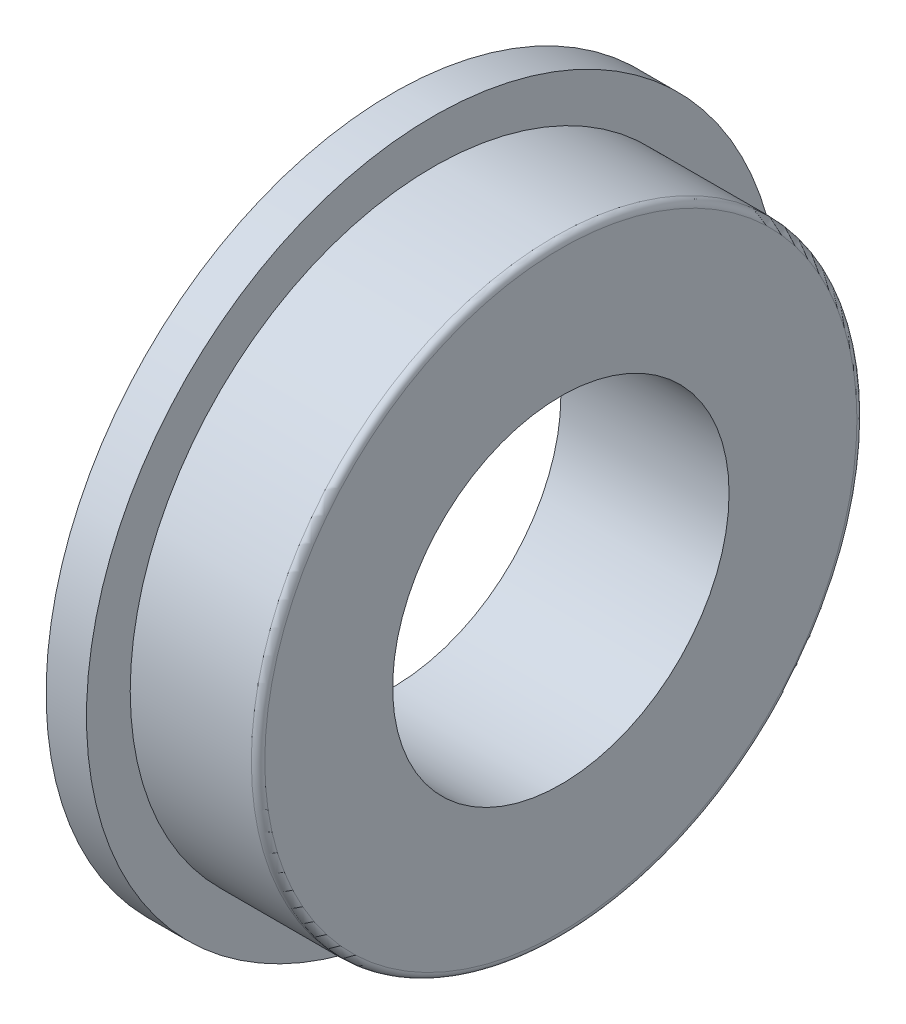
ISO-10303-21;
HEADER;
FILE_DESCRIPTION(('STEP AP214'),'2;1');
FILE_NAME('part.step','',(''),(''),'','','');
FILE_SCHEMA(('AUTOMOTIVE_DESIGN { 1 0 10303 214 1 1 1 1 }'));
ENDSEC;
DATA;
#1=APPLICATION_CONTEXT('core data for automotive mechanical design processes');
#2=APPLICATION_PROTOCOL_DEFINITION('international standard','automotive_design',2000,#1);
#3=PRODUCT_CONTEXT('',#1,'mechanical');
#4=PRODUCT('Part','Part','',(#3));
#5=PRODUCT_RELATED_PRODUCT_CATEGORY('part','',(#4));
#6=PRODUCT_DEFINITION_FORMATION('','',#4);
#7=PRODUCT_DEFINITION_CONTEXT('part definition',#1,'design');
#8=PRODUCT_DEFINITION('design','',#6,#7);
#9=PRODUCT_DEFINITION_SHAPE('','',#8);
#10=(LENGTH_UNIT() NAMED_UNIT(*) SI_UNIT(.MILLI.,.METRE.));
#11=(NAMED_UNIT(*) PLANE_ANGLE_UNIT() SI_UNIT($,.RADIAN.));
#12=(NAMED_UNIT(*) SI_UNIT($,.STERADIAN.) SOLID_ANGLE_UNIT());
#13=UNCERTAINTY_MEASURE_WITH_UNIT(LENGTH_MEASURE(1.E-05),#10,'distance_accuracy_value','');
#14=(GEOMETRIC_REPRESENTATION_CONTEXT(3) GLOBAL_UNCERTAINTY_ASSIGNED_CONTEXT((#13)) GLOBAL_UNIT_ASSIGNED_CONTEXT((#10,
#11,#12)) REPRESENTATION_CONTEXT('',''));
#15=CARTESIAN_POINT('',(0.,0.,0.));
#16=DIRECTION('',(0.,0.,1.));
#17=DIRECTION('',(1.,0.,0.));
#18=AXIS2_PLACEMENT_3D('',#15,#16,#17);
#19=CARTESIAN_POINT('',(0.6,0.,0.));
#20=DIRECTION('',(-1.,0.,0.));
#21=DIRECTION('',(0.,0.,1.));
#22=AXIS2_PLACEMENT_3D('',#19,#20,#21);
#23=CYLINDRICAL_SURFACE('',#22,5.15);
#24=CARTESIAN_POINT('',(0.6,0.,0.));
#25=DIRECTION('',(1.,0.,0.));
#26=DIRECTION('',(0.,0.,-1.));
#27=AXIS2_PLACEMENT_3D('',#24,#25,#26);
#28=CIRCLE('',#27,5.15);
#29=CARTESIAN_POINT('',(0.6,0.,-5.15));
#30=VERTEX_POINT('',#29);
#31=EDGE_CURVE('E56',#30,#30,#28,.T.);
#32=ORIENTED_EDGE('',*,*,#31,.F.);
#33=EDGE_LOOP('',(#32));
#34=FACE_BOUND('',#33,.T.);
#35=CARTESIAN_POINT('',(0.,0.,0.));
#36=DIRECTION('',(1.,0.,0.));
#37=DIRECTION('',(0.,0.,-1.));
#38=AXIS2_PLACEMENT_3D('',#35,#36,#37);
#39=CIRCLE('',#38,5.15);
#40=CARTESIAN_POINT('',(0.,0.,-5.15));
#41=VERTEX_POINT('',#40);
#42=EDGE_CURVE('E59',#41,#41,#39,.T.);
#43=ORIENTED_EDGE('',*,*,#42,.T.);
#44=EDGE_LOOP('',(#43));
#45=FACE_BOUND('',#44,.T.);
#46=ADVANCED_FACE('F41',(#34,#45),#23,.T.);
#47=CARTESIAN_POINT('',(0.6,0.,0.));
#48=DIRECTION('',(1.,0.,0.));
#49=DIRECTION('',(0.,0.,-1.));
#50=AXIS2_PLACEMENT_3D('',#47,#48,#49);
#51=PLANE('',#50);
#52=CARTESIAN_POINT('',(0.6,0.,0.));
#53=DIRECTION('',(1.,0.,0.));
#54=DIRECTION('',(0.,0.,-1.));
#55=AXIS2_PLACEMENT_3D('',#52,#53,#54);
#56=CIRCLE('',#55,4.5);
#57=CARTESIAN_POINT('',(0.6,0.,4.5));
#58=VERTEX_POINT('',#57);
#59=EDGE_CURVE('E52',#58,#58,#56,.T.);
#60=ORIENTED_EDGE('',*,*,#59,.F.);
#61=EDGE_LOOP('',(#60));
#62=FACE_BOUND('',#61,.T.);
#63=ORIENTED_EDGE('',*,*,#31,.T.);
#64=EDGE_LOOP('',(#63));
#65=FACE_BOUND('',#64,.T.);
#66=ADVANCED_FACE('F90',(#62,#65),#51,.T.);
#67=CARTESIAN_POINT('',(0.,0.,0.));
#68=DIRECTION('',(1.,0.,0.));
#69=DIRECTION('',(0.,0.,-1.));
#70=AXIS2_PLACEMENT_3D('',#67,#68,#69);
#71=PLANE('',#70);
#72=CARTESIAN_POINT('',(0.,0.,0.));
#73=DIRECTION('',(1.,0.,0.));
#74=DIRECTION('',(0.,0.,-1.));
#75=AXIS2_PLACEMENT_3D('',#72,#73,#74);
#76=CIRCLE('',#75,2.5);
#77=CARTESIAN_POINT('',(0.,0.,-2.5));
#78=VERTEX_POINT('',#77);
#79=EDGE_CURVE('E62',#78,#78,#76,.T.);
#80=ORIENTED_EDGE('',*,*,#79,.T.);
#81=EDGE_LOOP('',(#80));
#82=FACE_BOUND('',#81,.T.);
#83=ORIENTED_EDGE('',*,*,#42,.F.);
#84=EDGE_LOOP('',(#83));
#85=FACE_BOUND('',#84,.T.);
#86=ADVANCED_FACE('F71',(#82,#85),#71,.F.);
#87=CARTESIAN_POINT('',(2.5,0.,0.));
#88=DIRECTION('',(-1.,0.,0.));
#89=DIRECTION('',(0.,0.,1.));
#90=AXIS2_PLACEMENT_3D('',#87,#88,#89);
#91=CYLINDRICAL_SURFACE('',#90,4.5);
#92=CARTESIAN_POINT('',(2.4,0.,0.));
#93=DIRECTION('',(1.,0.,0.));
#94=DIRECTION('',(0.,0.,-1.));
#95=AXIS2_PLACEMENT_3D('',#92,#93,#94);
#96=CIRCLE('',#95,4.5);
#97=CARTESIAN_POINT('',(2.4,0.,4.5));
#98=VERTEX_POINT('',#97);
#99=EDGE_CURVE('E10',#98,#98,#96,.F.);
#100=CARTESIAN_POINT('',(2.4,0.,4.5));
#101=CARTESIAN_POINT('',(2.38125,0.,4.5));
#102=CARTESIAN_POINT('',(2.3625,0.,4.5));
#103=CARTESIAN_POINT('',(2.325,0.,4.5));
#104=CARTESIAN_POINT('',(2.30625,0.,4.5));
#105=CARTESIAN_POINT('',(2.26875,0.,4.5));
#106=CARTESIAN_POINT('',(2.25,0.,4.5));
#107=CARTESIAN_POINT('',(2.2125,0.,4.5));
#108=CARTESIAN_POINT('',(2.19375,0.,4.5));
#109=CARTESIAN_POINT('',(2.15625,0.,4.5));
#110=CARTESIAN_POINT('',(2.1375,0.,4.5));
#111=CARTESIAN_POINT('',(2.1,0.,4.5));
#112=CARTESIAN_POINT('',(2.08125,0.,4.5));
#113=CARTESIAN_POINT('',(2.04375,0.,4.5));
#114=CARTESIAN_POINT('',(2.025,0.,4.5));
#115=CARTESIAN_POINT('',(1.9875,0.,4.5));
#116=CARTESIAN_POINT('',(1.96875,0.,4.5));
#117=CARTESIAN_POINT('',(1.93125,0.,4.5));
#118=CARTESIAN_POINT('',(1.9125,0.,4.5));
#119=CARTESIAN_POINT('',(1.875,0.,4.5));
#120=CARTESIAN_POINT('',(1.85625,0.,4.5));
#121=CARTESIAN_POINT('',(1.81875,0.,4.5));
#122=CARTESIAN_POINT('',(1.8,0.,4.5));
#123=CARTESIAN_POINT('',(1.7625,0.,4.5));
#124=CARTESIAN_POINT('',(1.74375,0.,4.5));
#125=CARTESIAN_POINT('',(1.70625,0.,4.5));
#126=CARTESIAN_POINT('',(1.6875,0.,4.5));
#127=CARTESIAN_POINT('',(1.65,0.,4.5));
#128=CARTESIAN_POINT('',(1.63125,0.,4.5));
#129=CARTESIAN_POINT('',(1.59375,0.,4.5));
#130=CARTESIAN_POINT('',(1.575,0.,4.5));
#131=CARTESIAN_POINT('',(1.5375,0.,4.5));
#132=CARTESIAN_POINT('',(1.51875,0.,4.5));
#133=CARTESIAN_POINT('',(1.48125,0.,4.5));
#134=CARTESIAN_POINT('',(1.4625,0.,4.5));
#135=CARTESIAN_POINT('',(1.425,0.,4.5));
#136=CARTESIAN_POINT('',(1.40625,0.,4.5));
#137=CARTESIAN_POINT('',(1.36875,0.,4.5));
#138=CARTESIAN_POINT('',(1.35,0.,4.5));
#139=CARTESIAN_POINT('',(1.3125,0.,4.5));
#140=CARTESIAN_POINT('',(1.29375,0.,4.5));
#141=CARTESIAN_POINT('',(1.25625,0.,4.5));
#142=CARTESIAN_POINT('',(1.2375,0.,4.5));
#143=CARTESIAN_POINT('',(1.2,0.,4.5));
#144=CARTESIAN_POINT('',(1.18125,0.,4.5));
#145=CARTESIAN_POINT('',(1.14375,0.,4.5));
#146=CARTESIAN_POINT('',(1.125,0.,4.5));
#147=CARTESIAN_POINT('',(1.0875,0.,4.5));
#148=CARTESIAN_POINT('',(1.06875,0.,4.5));
#149=CARTESIAN_POINT('',(1.03125,0.,4.5));
#150=CARTESIAN_POINT('',(1.0125,0.,4.5));
#151=CARTESIAN_POINT('',(0.975,0.,4.5));
#152=CARTESIAN_POINT('',(0.95625,0.,4.5));
#153=CARTESIAN_POINT('',(0.91875,0.,4.5));
#154=CARTESIAN_POINT('',(0.9,0.,4.5));
#155=CARTESIAN_POINT('',(0.8625,0.,4.5));
#156=CARTESIAN_POINT('',(0.84375,0.,4.5));
#157=CARTESIAN_POINT('',(0.80625,0.,4.5));
#158=CARTESIAN_POINT('',(0.7875,0.,4.5));
#159=CARTESIAN_POINT('',(0.75,0.,4.5));
#160=CARTESIAN_POINT('',(0.73125,0.,4.5));
#161=CARTESIAN_POINT('',(0.69375,0.,4.5));
#162=CARTESIAN_POINT('',(0.675,0.,4.5));
#163=CARTESIAN_POINT('',(0.6375,0.,4.5));
#164=CARTESIAN_POINT('',(0.61875,0.,4.5));
#165=CARTESIAN_POINT('',(0.6,0.,4.5));
#166=B_SPLINE_CURVE_WITH_KNOTS('',3,(#100,#101,#102,#103,#104,#105,#106,#107,#108,#109,#110,
#111,#112,#113,#114,#115,#116,#117,#118,#119,#120,#121,#122,#123,#124,#125,#126,#127,#128,#129,
#130,#131,#132,#133,#134,#135,#136,#137,#138,#139,#140,#141,#142,#143,#144,#145,#146,#147,#148,
#149,#150,#151,#152,#153,#154,#155,#156,#157,#158,#159,#160,#161,#162,#163,#164,#165),
.UNSPECIFIED.,.F.,.F.,(4,2,2,2,2,2,2,2,2,2,2,2,2,2,2,2,2,2,2,2,2,2,2,2,2,2,2,2,2,2,2,2,4),(0.,
0.0562499999999999,0.1125,0.16875,0.225,0.28125,0.3375,0.39375,0.45,0.50625,0.5625,0.61875,
0.675,0.73125,0.7875,0.84375,0.9,0.95625,1.0125,1.06875,1.125,1.18125,1.2375,1.29375,1.35,
1.40625,1.4625,1.51875,1.575,1.63125,1.6875,1.74375,1.8),.UNSPECIFIED.);
#167=EDGE_CURVE('BSEAM82',#98,#58,#166,.T.);
#168=ORIENTED_EDGE('',*,*,#99,.T.);
#169=ORIENTED_EDGE('',*,*,#59,.T.);
#170=ORIENTED_EDGE('',*,*,#167,.T.);
#171=ORIENTED_EDGE('',*,*,#167,.F.);
#172=EDGE_LOOP('',(#168,#170,#169,#171));
#173=FACE_BOUND('',#172,.T.);
#174=ADVANCED_FACE('F82',(#173),#91,.T.);
#175=CARTESIAN_POINT('',(2.5,0.,0.));
#176=DIRECTION('',(1.,0.,0.));
#177=DIRECTION('',(0.,0.,-1.));
#178=AXIS2_PLACEMENT_3D('',#175,#176,#177);
#179=PLANE('',#178);
#180=CARTESIAN_POINT('',(2.5,0.,0.));
#181=DIRECTION('',(1.,0.,0.));
#182=DIRECTION('',(0.,0.,-1.));
#183=AXIS2_PLACEMENT_3D('',#180,#181,#182);
#184=CIRCLE('',#183,4.4);
#185=CARTESIAN_POINT('',(2.5,0.,-4.4));
#186=VERTEX_POINT('',#185);
#187=EDGE_CURVE('E48',#186,#186,#184,.T.);
#188=ORIENTED_EDGE('',*,*,#187,.T.);
#189=EDGE_LOOP('',(#188));
#190=FACE_BOUND('',#189,.T.);
#191=CARTESIAN_POINT('',(2.5,0.,0.));
#192=DIRECTION('',(1.,0.,0.));
#193=DIRECTION('',(0.,0.,-1.));
#194=AXIS2_PLACEMENT_3D('',#191,#192,#193);
#195=CIRCLE('',#194,2.5);
#196=CARTESIAN_POINT('',(2.5,0.,-2.5));
#197=VERTEX_POINT('',#196);
#198=EDGE_CURVE('E65',#197,#197,#195,.T.);
#199=ORIENTED_EDGE('',*,*,#198,.F.);
#200=EDGE_LOOP('',(#199));
#201=FACE_BOUND('',#200,.T.);
#202=ADVANCED_FACE('F77',(#190,#201),#179,.T.);
#203=CARTESIAN_POINT('',(0.,0.,0.));
#204=DIRECTION('',(1.,0.,0.));
#205=DIRECTION('',(0.,0.,-1.));
#206=AXIS2_PLACEMENT_3D('',#203,#204,#205);
#207=CYLINDRICAL_SURFACE('',#206,2.5);
#208=ORIENTED_EDGE('',*,*,#79,.F.);
#209=EDGE_LOOP('',(#208));
#210=FACE_BOUND('',#209,.T.);
#211=ORIENTED_EDGE('',*,*,#198,.T.);
#212=EDGE_LOOP('',(#211));
#213=FACE_BOUND('',#212,.T.);
#214=ADVANCED_FACE('F74',(#210,#213),#207,.F.);
#215=CARTESIAN_POINT('',(2.4,0.,0.));
#216=DIRECTION('',(1.,0.,0.));
#217=DIRECTION('',(0.,0.,-1.));
#218=AXIS2_PLACEMENT_3D('',#215,#216,#217);
#219=TOROIDAL_SURFACE('',#218,4.4,0.1);
#220=ORIENTED_EDGE('',*,*,#99,.F.);
#221=EDGE_LOOP('',(#220));
#222=FACE_BOUND('',#221,.T.);
#223=ORIENTED_EDGE('',*,*,#187,.F.);
#224=EDGE_LOOP('',(#223));
#225=FACE_BOUND('',#224,.T.);
#226=ADVANCED_FACE('F43',(#222,#225),#219,.T.);
#227=CLOSED_SHELL('',(#46,#66,#86,#174,#202,#214,#226));
#228=MANIFOLD_SOLID_BREP('B2',#227);
#229=ADVANCED_BREP_SHAPE_REPRESENTATION('',(#18,#228),#14);
#230=SHAPE_DEFINITION_REPRESENTATION(#9,#229);
ENDSEC;
END-ISO-10303-21;
